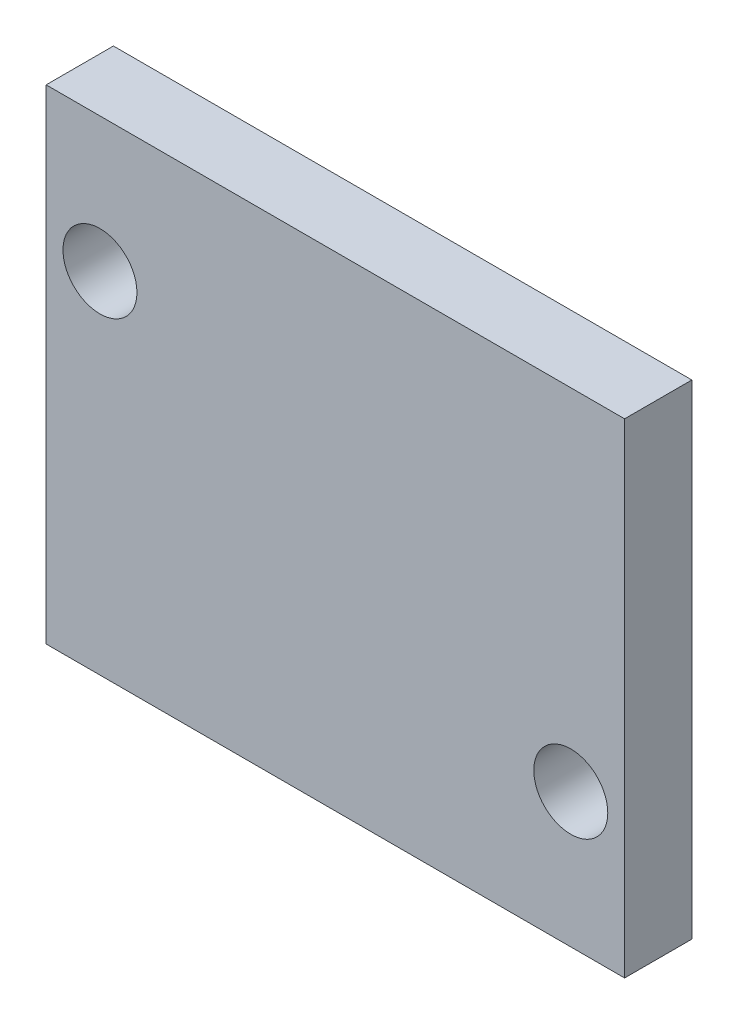
ISO-10303-21;
HEADER;
FILE_DESCRIPTION(('STEP AP214'),'2;1');
FILE_NAME('part.step','',(''),(''),'','','');
FILE_SCHEMA(('AUTOMOTIVE_DESIGN { 1 0 10303 214 1 1 1 1 }'));
ENDSEC;
DATA;
#1=APPLICATION_CONTEXT('core data for automotive mechanical design processes');
#2=APPLICATION_PROTOCOL_DEFINITION('international standard','automotive_design',2000,#1);
#3=PRODUCT_CONTEXT('',#1,'mechanical');
#4=PRODUCT('Part','Part','',(#3));
#5=PRODUCT_RELATED_PRODUCT_CATEGORY('part','',(#4));
#6=PRODUCT_DEFINITION_FORMATION('','',#4);
#7=PRODUCT_DEFINITION_CONTEXT('part definition',#1,'design');
#8=PRODUCT_DEFINITION('design','',#6,#7);
#9=PRODUCT_DEFINITION_SHAPE('','',#8);
#10=(LENGTH_UNIT() NAMED_UNIT(*) SI_UNIT(.MILLI.,.METRE.));
#11=(NAMED_UNIT(*) PLANE_ANGLE_UNIT() SI_UNIT($,.RADIAN.));
#12=(NAMED_UNIT(*) SI_UNIT($,.STERADIAN.) SOLID_ANGLE_UNIT());
#13=UNCERTAINTY_MEASURE_WITH_UNIT(LENGTH_MEASURE(1.E-05),#10,'distance_accuracy_value','');
#14=(GEOMETRIC_REPRESENTATION_CONTEXT(3) GLOBAL_UNCERTAINTY_ASSIGNED_CONTEXT((#13)) GLOBAL_UNIT_ASSIGNED_CONTEXT((#10,
#11,#12)) REPRESENTATION_CONTEXT('',''));
#15=CARTESIAN_POINT('',(0.,0.,0.));
#16=DIRECTION('',(0.,0.,1.));
#17=DIRECTION('',(1.,0.,0.));
#18=AXIS2_PLACEMENT_3D('',#15,#16,#17);
#19=CARTESIAN_POINT('',(0.,0.,5.));
#20=DIRECTION('',(0.,0.,1.));
#21=DIRECTION('',(1.,0.,0.));
#22=AXIS2_PLACEMENT_3D('',#19,#20,#21);
#23=PLANE('',#22);
#24=CARTESIAN_POINT('',(4.,26.,5.));
#25=DIRECTION('',(0.,0.,1.));
#26=DIRECTION('',(1.,0.,0.));
#27=AXIS2_PLACEMENT_3D('',#24,#25,#26);
#28=CIRCLE('',#27,2.75);
#29=CARTESIAN_POINT('',(6.75,26.,5.));
#30=VERTEX_POINT('',#29);
#31=EDGE_CURVE('E99',#30,#30,#28,.T.);
#32=ORIENTED_EDGE('',*,*,#31,.F.);
#33=EDGE_LOOP('',(#32));
#34=FACE_BOUND('',#33,.T.);
#35=DIRECTION('',(0.,-1.,0.));
#36=VECTOR('',#35,1.);
#37=CARTESIAN_POINT('',(0.,36.,5.));
#38=LINE('',#37,#36);
#39=CARTESIAN_POINT('',(0.,36.,5.));
#40=VERTEX_POINT('',#39);
#41=CARTESIAN_POINT('',(0.,0.,5.));
#42=VERTEX_POINT('',#41);
#43=EDGE_CURVE('E84',#40,#42,#38,.T.);
#44=ORIENTED_EDGE('',*,*,#43,.T.);
#45=DIRECTION('',(1.,0.,0.));
#46=VECTOR('',#45,1.);
#47=CARTESIAN_POINT('',(0.,0.,5.));
#48=LINE('',#47,#46);
#49=CARTESIAN_POINT('',(43.,0.,5.));
#50=VERTEX_POINT('',#49);
#51=EDGE_CURVE('E79',#42,#50,#48,.T.);
#52=ORIENTED_EDGE('',*,*,#51,.T.);
#53=DIRECTION('',(0.,1.,0.));
#54=VECTOR('',#53,1.);
#55=CARTESIAN_POINT('',(43.,36.,5.));
#56=LINE('',#55,#54);
#57=CARTESIAN_POINT('',(43.,36.,5.));
#58=VERTEX_POINT('',#57);
#59=EDGE_CURVE('E82',#50,#58,#56,.T.);
#60=ORIENTED_EDGE('',*,*,#59,.T.);
#61=DIRECTION('',(-1.,0.,0.));
#62=VECTOR('',#61,1.);
#63=CARTESIAN_POINT('',(0.,36.,5.));
#64=LINE('',#63,#62);
#65=EDGE_CURVE('E49',#58,#40,#64,.T.);
#66=ORIENTED_EDGE('',*,*,#65,.T.);
#67=EDGE_LOOP('',(#44,#52,#60,#66));
#68=FACE_BOUND('',#67,.T.);
#69=CARTESIAN_POINT('',(39.,10.,5.));
#70=DIRECTION('',(0.,0.,1.));
#71=DIRECTION('',(1.,0.,0.));
#72=AXIS2_PLACEMENT_3D('',#69,#70,#71);
#73=CIRCLE('',#72,2.75000000000001);
#74=CARTESIAN_POINT('',(41.75,10.,5.));
#75=VERTEX_POINT('',#74);
#76=EDGE_CURVE('E114',#75,#75,#73,.T.);
#77=ORIENTED_EDGE('',*,*,#76,.F.);
#78=EDGE_LOOP('',(#77));
#79=FACE_BOUND('',#78,.T.);
#80=ADVANCED_FACE('F32',(#34,#68,#79),#23,.T.);
#81=CARTESIAN_POINT('',(0.,0.,0.));
#82=DIRECTION('',(0.,0.,1.));
#83=DIRECTION('',(1.,0.,0.));
#84=AXIS2_PLACEMENT_3D('',#81,#82,#83);
#85=PLANE('',#84);
#86=DIRECTION('',(0.,-1.,0.));
#87=VECTOR('',#86,1.);
#88=CARTESIAN_POINT('',(0.,36.,0.));
#89=LINE('',#88,#87);
#90=CARTESIAN_POINT('',(0.,36.,0.));
#91=VERTEX_POINT('',#90);
#92=CARTESIAN_POINT('',(0.,0.,0.));
#93=VERTEX_POINT('',#92);
#94=EDGE_CURVE('E96',#91,#93,#89,.T.);
#95=ORIENTED_EDGE('',*,*,#94,.F.);
#96=DIRECTION('',(-1.,0.,0.));
#97=VECTOR('',#96,1.);
#98=CARTESIAN_POINT('',(0.,36.,0.));
#99=LINE('',#98,#97);
#100=CARTESIAN_POINT('',(43.,36.,0.));
#101=VERTEX_POINT('',#100);
#102=EDGE_CURVE('E72',#101,#91,#99,.T.);
#103=ORIENTED_EDGE('',*,*,#102,.F.);
#104=DIRECTION('',(0.,1.,0.));
#105=VECTOR('',#104,1.);
#106=CARTESIAN_POINT('',(43.,36.,0.));
#107=LINE('',#106,#105);
#108=CARTESIAN_POINT('',(43.,0.,0.));
#109=VERTEX_POINT('',#108);
#110=EDGE_CURVE('E66',#109,#101,#107,.T.);
#111=ORIENTED_EDGE('',*,*,#110,.F.);
#112=DIRECTION('',(1.,0.,0.));
#113=VECTOR('',#112,1.);
#114=CARTESIAN_POINT('',(0.,0.,0.));
#115=LINE('',#114,#113);
#116=EDGE_CURVE('E88',#93,#109,#115,.T.);
#117=ORIENTED_EDGE('',*,*,#116,.F.);
#118=EDGE_LOOP('',(#95,#103,#111,#117));
#119=FACE_BOUND('',#118,.T.);
#120=CARTESIAN_POINT('',(4.,26.,0.));
#121=DIRECTION('',(0.,0.,1.));
#122=DIRECTION('',(1.,0.,0.));
#123=AXIS2_PLACEMENT_3D('',#120,#121,#122);
#124=CIRCLE('',#123,2.75);
#125=CARTESIAN_POINT('',(6.75,26.,0.));
#126=VERTEX_POINT('',#125);
#127=EDGE_CURVE('E111',#126,#126,#124,.T.);
#128=ORIENTED_EDGE('',*,*,#127,.T.);
#129=EDGE_LOOP('',(#128));
#130=FACE_BOUND('',#129,.T.);
#131=CARTESIAN_POINT('',(39.,10.,0.));
#132=DIRECTION('',(0.,0.,1.));
#133=DIRECTION('',(1.,0.,0.));
#134=AXIS2_PLACEMENT_3D('',#131,#132,#133);
#135=CIRCLE('',#134,2.75000000000001);
#136=CARTESIAN_POINT('',(41.75,10.,0.));
#137=VERTEX_POINT('',#136);
#138=EDGE_CURVE('E117',#137,#137,#135,.T.);
#139=ORIENTED_EDGE('',*,*,#138,.T.);
#140=EDGE_LOOP('',(#139));
#141=FACE_BOUND('',#140,.T.);
#142=ADVANCED_FACE('F107',(#119,#130,#141),#85,.F.);
#143=CARTESIAN_POINT('',(0.,36.,5.));
#144=DIRECTION('',(1.,0.,0.));
#145=DIRECTION('',(0.,1.,0.));
#146=AXIS2_PLACEMENT_3D('',#143,#144,#145);
#147=PLANE('',#146);
#148=ORIENTED_EDGE('',*,*,#94,.T.);
#149=DIRECTION('',(0.,0.,-1.));
#150=VECTOR('',#149,1.);
#151=CARTESIAN_POINT('',(0.,0.,5.));
#152=LINE('',#151,#150);
#153=EDGE_CURVE('E11',#42,#93,#152,.T.);
#154=ORIENTED_EDGE('',*,*,#153,.F.);
#155=ORIENTED_EDGE('',*,*,#43,.F.);
#156=DIRECTION('',(0.,0.,-1.));
#157=VECTOR('',#156,1.);
#158=CARTESIAN_POINT('',(0.,36.,5.));
#159=LINE('',#158,#157);
#160=EDGE_CURVE('E92',#40,#91,#159,.T.);
#161=ORIENTED_EDGE('',*,*,#160,.T.);
#162=EDGE_LOOP('',(#148,#154,#155,#161));
#163=FACE_BOUND('',#162,.T.);
#164=ADVANCED_FACE('F34',(#163),#147,.F.);
#165=CARTESIAN_POINT('',(0.,0.,5.));
#166=DIRECTION('',(0.,1.,0.));
#167=DIRECTION('',(0.,0.,1.));
#168=AXIS2_PLACEMENT_3D('',#165,#166,#167);
#169=PLANE('',#168);
#170=ORIENTED_EDGE('',*,*,#116,.T.);
#171=DIRECTION('',(0.,0.,-1.));
#172=VECTOR('',#171,1.);
#173=CARTESIAN_POINT('',(43.,0.,5.));
#174=LINE('',#173,#172);
#175=EDGE_CURVE('E41',#50,#109,#174,.T.);
#176=ORIENTED_EDGE('',*,*,#175,.F.);
#177=ORIENTED_EDGE('',*,*,#51,.F.);
#178=ORIENTED_EDGE('',*,*,#153,.T.);
#179=EDGE_LOOP('',(#170,#176,#177,#178));
#180=FACE_BOUND('',#179,.T.);
#181=ADVANCED_FACE('F87',(#180),#169,.F.);
#182=CARTESIAN_POINT('',(43.,36.,5.));
#183=DIRECTION('',(-1.,0.,0.));
#184=DIRECTION('',(0.,0.,1.));
#185=AXIS2_PLACEMENT_3D('',#182,#183,#184);
#186=PLANE('',#185);
#187=ORIENTED_EDGE('',*,*,#110,.T.);
#188=DIRECTION('',(0.,0.,-1.));
#189=VECTOR('',#188,1.);
#190=CARTESIAN_POINT('',(43.,36.,5.));
#191=LINE('',#190,#189);
#192=EDGE_CURVE('E89',#58,#101,#191,.T.);
#193=ORIENTED_EDGE('',*,*,#192,.F.);
#194=ORIENTED_EDGE('',*,*,#59,.F.);
#195=ORIENTED_EDGE('',*,*,#175,.T.);
#196=EDGE_LOOP('',(#187,#193,#194,#195));
#197=FACE_BOUND('',#196,.T.);
#198=ADVANCED_FACE('F90',(#197),#186,.F.);
#199=CARTESIAN_POINT('',(0.,36.,5.));
#200=DIRECTION('',(0.,-1.,0.));
#201=DIRECTION('',(0.,0.,-1.));
#202=AXIS2_PLACEMENT_3D('',#199,#200,#201);
#203=PLANE('',#202);
#204=ORIENTED_EDGE('',*,*,#102,.T.);
#205=ORIENTED_EDGE('',*,*,#160,.F.);
#206=ORIENTED_EDGE('',*,*,#65,.F.);
#207=ORIENTED_EDGE('',*,*,#192,.T.);
#208=EDGE_LOOP('',(#204,#205,#206,#207));
#209=FACE_BOUND('',#208,.T.);
#210=ADVANCED_FACE('F104',(#209),#203,.F.);
#211=CARTESIAN_POINT('',(4.,26.,5.));
#212=DIRECTION('',(0.,0.,-1.));
#213=DIRECTION('',(-1.,0.,0.));
#214=AXIS2_PLACEMENT_3D('',#211,#212,#213);
#215=CYLINDRICAL_SURFACE('',#214,2.75);
#216=ORIENTED_EDGE('',*,*,#31,.T.);
#217=EDGE_LOOP('',(#216));
#218=FACE_BOUND('',#217,.T.);
#219=ORIENTED_EDGE('',*,*,#127,.F.);
#220=EDGE_LOOP('',(#219));
#221=FACE_BOUND('',#220,.T.);
#222=ADVANCED_FACE('F134',(#218,#221),#215,.F.);
#223=CARTESIAN_POINT('',(39.,10.,5.));
#224=DIRECTION('',(0.,0.,-1.));
#225=DIRECTION('',(-1.,0.,0.));
#226=AXIS2_PLACEMENT_3D('',#223,#224,#225);
#227=CYLINDRICAL_SURFACE('',#226,2.75000000000001);
#228=ORIENTED_EDGE('',*,*,#76,.T.);
#229=EDGE_LOOP('',(#228));
#230=FACE_BOUND('',#229,.T.);
#231=ORIENTED_EDGE('',*,*,#138,.F.);
#232=EDGE_LOOP('',(#231));
#233=FACE_BOUND('',#232,.T.);
#234=ADVANCED_FACE('F123',(#230,#233),#227,.F.);
#235=CLOSED_SHELL('',(#80,#142,#164,#181,#198,#210,#222,#234));
#236=MANIFOLD_SOLID_BREP('B2',#235);
#237=ADVANCED_BREP_SHAPE_REPRESENTATION('',(#18,#236),#14);
#238=SHAPE_DEFINITION_REPRESENTATION(#9,#237);
ENDSEC;
END-ISO-10303-21;
